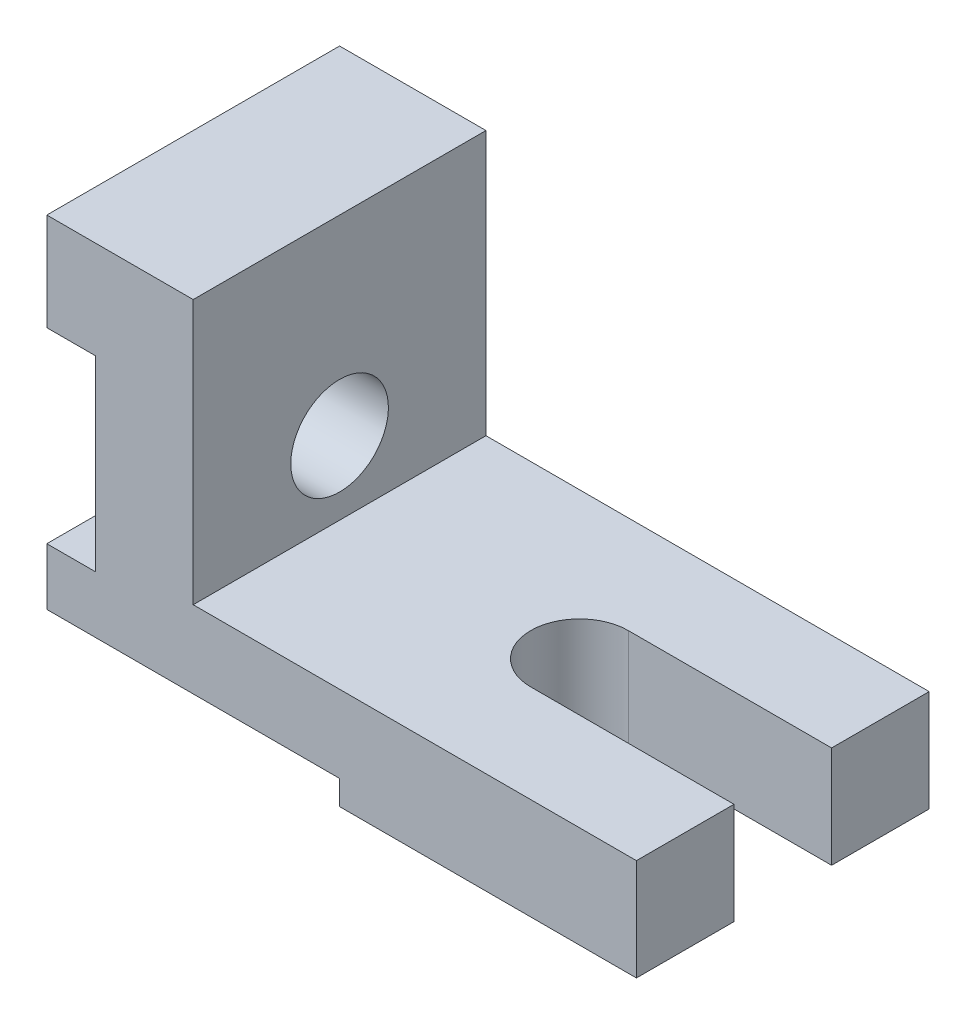
ISO-10303-21;
HEADER;
FILE_DESCRIPTION(('STEP AP214'),'2;1');
FILE_NAME('part.step','',(''),(''),'','','');
FILE_SCHEMA(('AUTOMOTIVE_DESIGN { 1 0 10303 214 1 1 1 1 }'));
ENDSEC;
DATA;
#1=APPLICATION_CONTEXT('core data for automotive mechanical design processes');
#2=APPLICATION_PROTOCOL_DEFINITION('international standard','automotive_design',2000,#1);
#3=PRODUCT_CONTEXT('',#1,'mechanical');
#4=PRODUCT('Part','Part','',(#3));
#5=PRODUCT_RELATED_PRODUCT_CATEGORY('part','',(#4));
#6=PRODUCT_DEFINITION_FORMATION('','',#4);
#7=PRODUCT_DEFINITION_CONTEXT('part definition',#1,'design');
#8=PRODUCT_DEFINITION('design','',#6,#7);
#9=PRODUCT_DEFINITION_SHAPE('','',#8);
#10=(LENGTH_UNIT() NAMED_UNIT(*) SI_UNIT(.MILLI.,.METRE.));
#11=(NAMED_UNIT(*) PLANE_ANGLE_UNIT() SI_UNIT($,.RADIAN.));
#12=(NAMED_UNIT(*) SI_UNIT($,.STERADIAN.) SOLID_ANGLE_UNIT());
#13=UNCERTAINTY_MEASURE_WITH_UNIT(LENGTH_MEASURE(1.E-05),#10,'distance_accuracy_value','');
#14=(GEOMETRIC_REPRESENTATION_CONTEXT(3) GLOBAL_UNCERTAINTY_ASSIGNED_CONTEXT((#13)) GLOBAL_UNIT_ASSIGNED_CONTEXT((#10,
#11,#12)) REPRESENTATION_CONTEXT('',''));
#15=CARTESIAN_POINT('',(0.,0.,0.));
#16=DIRECTION('',(0.,0.,1.));
#17=DIRECTION('',(1.,0.,0.));
#18=AXIS2_PLACEMENT_3D('',#15,#16,#17);
#19=CARTESIAN_POINT('',(145.,25.,72.));
#20=DIRECTION('',(1.,0.,0.));
#21=DIRECTION('',(0.,0.,-1.));
#22=AXIS2_PLACEMENT_3D('',#19,#20,#21);
#23=PLANE('',#22);
#24=DIRECTION('',(0.,1.,0.));
#25=VECTOR('',#24,1.);
#26=CARTESIAN_POINT('',(145.,-0.000999999999997531,48.));
#27=LINE('',#26,#25);
#28=CARTESIAN_POINT('',(145.,0.,48.));
#29=VERTEX_POINT('',#28);
#30=CARTESIAN_POINT('',(145.,25.,48.));
#31=VERTEX_POINT('',#30);
#32=EDGE_CURVE('E193',#29,#31,#27,.T.);
#33=ORIENTED_EDGE('',*,*,#32,.T.);
#34=DIRECTION('',(0.,0.,-1.));
#35=VECTOR('',#34,1.);
#36=CARTESIAN_POINT('',(145.,25.,72.));
#37=LINE('',#36,#35);
#38=CARTESIAN_POINT('',(145.,25.,72.));
#39=VERTEX_POINT('',#38);
#40=EDGE_CURVE('E208',#39,#31,#37,.T.);
#41=ORIENTED_EDGE('',*,*,#40,.F.);
#42=DIRECTION('',(0.,-1.,0.));
#43=VECTOR('',#42,1.);
#44=CARTESIAN_POINT('',(145.,25.,72.));
#45=LINE('',#44,#43);
#46=CARTESIAN_POINT('',(145.,0.,72.));
#47=VERTEX_POINT('',#46);
#48=EDGE_CURVE('E318',#39,#47,#45,.T.);
#49=ORIENTED_EDGE('',*,*,#48,.T.);
#50=DIRECTION('',(0.,0.,-1.));
#51=VECTOR('',#50,1.);
#52=CARTESIAN_POINT('',(145.,0.,72.));
#53=LINE('',#52,#51);
#54=EDGE_CURVE('E56',#47,#29,#53,.T.);
#55=ORIENTED_EDGE('',*,*,#54,.T.);
#56=EDGE_LOOP('',(#33,#41,#49,#55));
#57=FACE_BOUND('',#56,.T.);
#58=ADVANCED_FACE('F47',(#57),#23,.T.);
#59=CARTESIAN_POINT('',(12.,66.,72.));
#60=DIRECTION('',(1.,0.,0.));
#61=DIRECTION('',(0.,1.,0.));
#62=AXIS2_PLACEMENT_3D('',#59,#60,#61);
#63=PLANE('',#62);
#64=DIRECTION('',(0.,-1.,0.));
#65=VECTOR('',#64,1.);
#66=CARTESIAN_POINT('',(12.,66.,0.));
#67=LINE('',#66,#65);
#68=CARTESIAN_POINT('',(12.,66.,0.));
#69=VERTEX_POINT('',#68);
#70=CARTESIAN_POINT('',(12.,20.,0.));
#71=VERTEX_POINT('',#70);
#72=EDGE_CURVE('E259',#69,#71,#67,.T.);
#73=ORIENTED_EDGE('',*,*,#72,.T.);
#74=DIRECTION('',(0.,0.,-1.));
#75=VECTOR('',#74,1.);
#76=CARTESIAN_POINT('',(12.,20.,72.));
#77=LINE('',#76,#75);
#78=CARTESIAN_POINT('',(12.,20.,16.7386397157418));
#79=VERTEX_POINT('',#78);
#80=EDGE_CURVE('E248',#79,#71,#77,.T.);
#81=ORIENTED_EDGE('',*,*,#80,.F.);
#82=CARTESIAN_POINT('',(12.,43.,36.));
#83=DIRECTION('',(-1.,0.,0.));
#84=DIRECTION('',(0.,-1.,0.));
#85=AXIS2_PLACEMENT_3D('',#82,#83,#84);
#86=CIRCLE('',#85,30.);
#87=CARTESIAN_POINT('',(12.,20.,55.2613602842582));
#88=VERTEX_POINT('',#87);
#89=EDGE_CURVE('E378',#79,#88,#86,.T.);
#90=ORIENTED_EDGE('',*,*,#89,.T.);
#91=CARTESIAN_POINT('',(12.,20.,72.));
#92=VERTEX_POINT('',#91);
#93=EDGE_CURVE('E244',#92,#88,#77,.T.);
#94=ORIENTED_EDGE('',*,*,#93,.F.);
#95=DIRECTION('',(0.,-1.,0.));
#96=VECTOR('',#95,1.);
#97=CARTESIAN_POINT('',(12.,66.,72.));
#98=LINE('',#97,#96);
#99=CARTESIAN_POINT('',(12.,66.,72.));
#100=VERTEX_POINT('',#99);
#101=EDGE_CURVE('E299',#100,#92,#98,.T.);
#102=ORIENTED_EDGE('',*,*,#101,.F.);
#103=DIRECTION('',(0.,0.,-1.));
#104=VECTOR('',#103,1.);
#105=CARTESIAN_POINT('',(12.,66.,72.));
#106=LINE('',#105,#104);
#107=CARTESIAN_POINT('',(12.,66.,55.2613602842582));
#108=VERTEX_POINT('',#107);
#109=EDGE_CURVE('E240',#100,#108,#106,.T.);
#110=ORIENTED_EDGE('',*,*,#109,.T.);
#111=CARTESIAN_POINT('',(12.,43.,36.));
#112=DIRECTION('',(-1.,0.,0.));
#113=DIRECTION('',(0.,-1.,0.));
#114=AXIS2_PLACEMENT_3D('',#111,#112,#113);
#115=CIRCLE('',#114,30.);
#116=CARTESIAN_POINT('',(12.,66.,16.7386397157418));
#117=VERTEX_POINT('',#116);
#118=EDGE_CURVE('E71',#108,#117,#115,.T.);
#119=ORIENTED_EDGE('',*,*,#118,.T.);
#120=EDGE_CURVE('E243',#117,#69,#106,.T.);
#121=ORIENTED_EDGE('',*,*,#120,.T.);
#122=EDGE_LOOP('',(#73,#81,#90,#94,#102,#110,#119,#121));
#123=FACE_BOUND('',#122,.T.);
#124=CARTESIAN_POINT('',(12.,43.,36.));
#125=DIRECTION('',(-1.,0.,0.));
#126=DIRECTION('',(0.,0.,1.));
#127=AXIS2_PLACEMENT_3D('',#124,#125,#126);
#128=CIRCLE('',#127,12.);
#129=CARTESIAN_POINT('',(12.,43.,48.));
#130=VERTEX_POINT('',#129);
#131=EDGE_CURVE('E392',#130,#130,#128,.T.);
#132=ORIENTED_EDGE('',*,*,#131,.F.);
#133=EDGE_LOOP('',(#132));
#134=FACE_BOUND('',#133,.T.);
#135=ADVANCED_FACE('F455',(#123,#134),#63,.F.);
#136=CARTESIAN_POINT('',(0.,20.,72.));
#137=DIRECTION('',(1.,0.,0.));
#138=DIRECTION('',(0.,1.,0.));
#139=AXIS2_PLACEMENT_3D('',#136,#137,#138);
#140=PLANE('',#139);
#141=CARTESIAN_POINT('',(0.,43.,36.));
#142=DIRECTION('',(1.,0.,0.));
#143=DIRECTION('',(0.,1.,0.));
#144=AXIS2_PLACEMENT_3D('',#141,#142,#143);
#145=CIRCLE('',#144,30.);
#146=CARTESIAN_POINT('',(0.,20.,55.2613602842582));
#147=VERTEX_POINT('',#146);
#148=CARTESIAN_POINT('',(0.,20.,16.7386397157418));
#149=VERTEX_POINT('',#148);
#150=EDGE_CURVE('E345',#147,#149,#145,.T.);
#151=ORIENTED_EDGE('',*,*,#150,.T.);
#152=DIRECTION('',(0.,0.,-1.));
#153=VECTOR('',#152,1.);
#154=CARTESIAN_POINT('',(0.,20.,72.));
#155=LINE('',#154,#153);
#156=CARTESIAN_POINT('',(0.,20.,0.));
#157=VERTEX_POINT('',#156);
#158=EDGE_CURVE('E253',#149,#157,#155,.T.);
#159=ORIENTED_EDGE('',*,*,#158,.T.);
#160=DIRECTION('',(0.,-1.,0.));
#161=VECTOR('',#160,1.);
#162=CARTESIAN_POINT('',(0.,20.,0.));
#163=LINE('',#162,#161);
#164=CARTESIAN_POINT('',(0.,0.,0.));
#165=VERTEX_POINT('',#164);
#166=EDGE_CURVE('E291',#157,#165,#163,.T.);
#167=ORIENTED_EDGE('',*,*,#166,.T.);
#168=DIRECTION('',(0.,0.,-1.));
#169=VECTOR('',#168,1.);
#170=CARTESIAN_POINT('',(0.,0.,72.));
#171=LINE('',#170,#169);
#172=CARTESIAN_POINT('',(0.,0.,22.));
#173=VERTEX_POINT('',#172);
#174=EDGE_CURVE('E11',#173,#165,#171,.T.);
#175=ORIENTED_EDGE('',*,*,#174,.F.);
#176=DIRECTION('',(0.,-1.,0.));
#177=VECTOR('',#176,1.);
#178=CARTESIAN_POINT('',(0.,0.,22.));
#179=LINE('',#178,#177);
#180=CARTESIAN_POINT('',(0.,6.,22.));
#181=VERTEX_POINT('',#180);
#182=EDGE_CURVE('E340',#181,#173,#179,.T.);
#183=ORIENTED_EDGE('',*,*,#182,.F.);
#184=DIRECTION('',(0.,0.,1.));
#185=VECTOR('',#184,1.);
#186=CARTESIAN_POINT('',(0.,6.,22.));
#187=LINE('',#186,#185);
#188=CARTESIAN_POINT('',(0.,6.,72.));
#189=VERTEX_POINT('',#188);
#190=EDGE_CURVE('E295',#181,#189,#187,.T.);
#191=ORIENTED_EDGE('',*,*,#190,.T.);
#192=DIRECTION('',(0.,-1.,0.));
#193=VECTOR('',#192,1.);
#194=CARTESIAN_POINT('',(0.,20.,72.));
#195=LINE('',#194,#193);
#196=CARTESIAN_POINT('',(0.,20.,72.));
#197=VERTEX_POINT('',#196);
#198=EDGE_CURVE('E258',#197,#189,#195,.T.);
#199=ORIENTED_EDGE('',*,*,#198,.F.);
#200=EDGE_CURVE('E249',#197,#147,#155,.T.);
#201=ORIENTED_EDGE('',*,*,#200,.T.);
#202=EDGE_LOOP('',(#151,#159,#167,#175,#183,#191,#199,#201));
#203=FACE_BOUND('',#202,.T.);
#204=ADVANCED_FACE('F49',(#203),#140,.F.);
#205=CARTESIAN_POINT('',(0.,90.,72.));
#206=DIRECTION('',(1.,0.,0.));
#207=DIRECTION('',(0.,1.,0.));
#208=AXIS2_PLACEMENT_3D('',#205,#206,#207);
#209=PLANE('',#208);
#210=CARTESIAN_POINT('',(0.,43.,36.));
#211=DIRECTION('',(1.,0.,0.));
#212=DIRECTION('',(0.,1.,0.));
#213=AXIS2_PLACEMENT_3D('',#210,#211,#212);
#214=CIRCLE('',#213,30.);
#215=CARTESIAN_POINT('',(0.,66.,16.7386397157418));
#216=VERTEX_POINT('',#215);
#217=CARTESIAN_POINT('',(0.,66.,55.2613602842582));
#218=VERTEX_POINT('',#217);
#219=EDGE_CURVE('E359',#216,#218,#214,.T.);
#220=ORIENTED_EDGE('',*,*,#219,.T.);
#221=DIRECTION('',(0.,0.,-1.));
#222=VECTOR('',#221,1.);
#223=CARTESIAN_POINT('',(0.,66.,72.));
#224=LINE('',#223,#222);
#225=CARTESIAN_POINT('',(0.,66.,72.));
#226=VERTEX_POINT('',#225);
#227=EDGE_CURVE('E235',#226,#218,#224,.T.);
#228=ORIENTED_EDGE('',*,*,#227,.F.);
#229=DIRECTION('',(0.,-1.,0.));
#230=VECTOR('',#229,1.);
#231=CARTESIAN_POINT('',(0.,90.,72.));
#232=LINE('',#231,#230);
#233=CARTESIAN_POINT('',(0.,90.,72.));
#234=VERTEX_POINT('',#233);
#235=EDGE_CURVE('E305',#234,#226,#232,.T.);
#236=ORIENTED_EDGE('',*,*,#235,.F.);
#237=DIRECTION('',(0.,0.,-1.));
#238=VECTOR('',#237,1.);
#239=CARTESIAN_POINT('',(0.,90.,72.));
#240=LINE('',#239,#238);
#241=CARTESIAN_POINT('',(0.,90.,0.));
#242=VERTEX_POINT('',#241);
#243=EDGE_CURVE('E232',#234,#242,#240,.T.);
#244=ORIENTED_EDGE('',*,*,#243,.T.);
#245=DIRECTION('',(0.,-1.,0.));
#246=VECTOR('',#245,1.);
#247=CARTESIAN_POINT('',(0.,90.,0.));
#248=LINE('',#247,#246);
#249=CARTESIAN_POINT('',(0.,66.,0.));
#250=VERTEX_POINT('',#249);
#251=EDGE_CURVE('E267',#242,#250,#248,.T.);
#252=ORIENTED_EDGE('',*,*,#251,.T.);
#253=EDGE_CURVE('E239',#216,#250,#224,.T.);
#254=ORIENTED_EDGE('',*,*,#253,.F.);
#255=EDGE_LOOP('',(#220,#228,#236,#244,#252,#254));
#256=FACE_BOUND('',#255,.T.);
#257=ADVANCED_FACE('F474',(#256),#209,.F.);
#258=CARTESIAN_POINT('',(0.,66.,72.));
#259=DIRECTION('',(0.,1.,0.));
#260=DIRECTION('',(0.,0.,1.));
#261=AXIS2_PLACEMENT_3D('',#258,#259,#260);
#262=PLANE('',#261);
#263=DIRECTION('',(1.,0.,0.));
#264=VECTOR('',#263,1.);
#265=CARTESIAN_POINT('',(-0.00100000000001314,66.,55.2613602842582));
#266=LINE('',#265,#264);
#267=EDGE_CURVE('E364',#218,#108,#266,.T.);
#268=ORIENTED_EDGE('',*,*,#267,.T.);
#269=ORIENTED_EDGE('',*,*,#109,.F.);
#270=DIRECTION('',(1.,0.,0.));
#271=VECTOR('',#270,1.);
#272=CARTESIAN_POINT('',(0.,66.,72.));
#273=LINE('',#272,#271);
#274=EDGE_CURVE('E302',#226,#100,#273,.T.);
#275=ORIENTED_EDGE('',*,*,#274,.F.);
#276=ORIENTED_EDGE('',*,*,#227,.T.);
#277=EDGE_LOOP('',(#268,#269,#275,#276));
#278=FACE_BOUND('',#277,.T.);
#279=ADVANCED_FACE('F476',(#278),#262,.F.);
#280=DIRECTION('',(1.,0.,0.));
#281=VECTOR('',#280,1.);
#282=CARTESIAN_POINT('',(-0.00100000000001314,66.,16.7386397157418));
#283=LINE('',#282,#281);
#284=EDGE_CURVE('E368',#117,#216,#283,.F.);
#285=ORIENTED_EDGE('',*,*,#284,.T.);
#286=ORIENTED_EDGE('',*,*,#253,.T.);
#287=DIRECTION('',(1.,0.,0.));
#288=VECTOR('',#287,1.);
#289=CARTESIAN_POINT('',(0.,66.,0.));
#290=LINE('',#289,#288);
#291=EDGE_CURVE('E263',#250,#69,#290,.T.);
#292=ORIENTED_EDGE('',*,*,#291,.T.);
#293=ORIENTED_EDGE('',*,*,#120,.F.);
#294=EDGE_LOOP('',(#285,#286,#292,#293));
#295=FACE_BOUND('',#294,.T.);
#296=ADVANCED_FACE('F460',(#295),#262,.F.);
#297=CARTESIAN_POINT('',(12.,20.,72.));
#298=DIRECTION('',(0.,-1.,0.));
#299=DIRECTION('',(1.,0.,0.));
#300=AXIS2_PLACEMENT_3D('',#297,#298,#299);
#301=PLANE('',#300);
#302=DIRECTION('',(1.,0.,0.));
#303=VECTOR('',#302,1.);
#304=CARTESIAN_POINT('',(-0.00100000000001979,20.,16.7386397157418));
#305=LINE('',#304,#303);
#306=EDGE_CURVE('E382',#149,#79,#305,.T.);
#307=ORIENTED_EDGE('',*,*,#306,.T.);
#308=ORIENTED_EDGE('',*,*,#80,.T.);
#309=DIRECTION('',(-1.,0.,0.));
#310=VECTOR('',#309,1.);
#311=CARTESIAN_POINT('',(12.,20.,0.));
#312=LINE('',#311,#310);
#313=EDGE_CURVE('E254',#71,#157,#312,.T.);
#314=ORIENTED_EDGE('',*,*,#313,.T.);
#315=ORIENTED_EDGE('',*,*,#158,.F.);
#316=EDGE_LOOP('',(#307,#308,#314,#315));
#317=FACE_BOUND('',#316,.T.);
#318=ADVANCED_FACE('F452',(#317),#301,.F.);
#319=DIRECTION('',(1.,0.,0.));
#320=VECTOR('',#319,1.);
#321=CARTESIAN_POINT('',(-0.00100000000001979,20.,55.2613602842582));
#322=LINE('',#321,#320);
#323=EDGE_CURVE('E363',#88,#147,#322,.F.);
#324=ORIENTED_EDGE('',*,*,#323,.T.);
#325=ORIENTED_EDGE('',*,*,#200,.F.);
#326=DIRECTION('',(-1.,0.,0.));
#327=VECTOR('',#326,1.);
#328=CARTESIAN_POINT('',(12.,20.,72.));
#329=LINE('',#328,#327);
#330=EDGE_CURVE('E296',#92,#197,#329,.T.);
#331=ORIENTED_EDGE('',*,*,#330,.F.);
#332=ORIENTED_EDGE('',*,*,#93,.T.);
#333=EDGE_LOOP('',(#324,#325,#331,#332));
#334=FACE_BOUND('',#333,.T.);
#335=ADVANCED_FACE('F483',(#334),#301,.F.);
#336=CARTESIAN_POINT('',(29.6466369276166,0.,72.));
#337=DIRECTION('',(0.,1.,0.));
#338=DIRECTION('',(0.,0.,1.));
#339=AXIS2_PLACEMENT_3D('',#336,#337,#338);
#340=PLANE('',#339);
#341=CARTESIAN_POINT('',(95.,0.,36.));
#342=DIRECTION('',(0.,1.,0.));
#343=DIRECTION('',(0.,0.,1.));
#344=AXIS2_PLACEMENT_3D('',#341,#342,#343);
#345=CIRCLE('',#344,12.);
#346=CARTESIAN_POINT('',(95.,0.,48.));
#347=VERTEX_POINT('',#346);
#348=CARTESIAN_POINT('',(95.,0.,24.));
#349=VERTEX_POINT('',#348);
#350=EDGE_CURVE('E212',#347,#349,#345,.F.);
#351=ORIENTED_EDGE('',*,*,#350,.F.);
#352=DIRECTION('',(-1.,0.,0.));
#353=VECTOR('',#352,1.);
#354=CARTESIAN_POINT('',(195.,0.,48.));
#355=LINE('',#354,#353);
#356=EDGE_CURVE('E408',#29,#347,#355,.T.);
#357=ORIENTED_EDGE('',*,*,#356,.F.);
#358=ORIENTED_EDGE('',*,*,#54,.F.);
#359=DIRECTION('',(1.,0.,0.));
#360=VECTOR('',#359,1.);
#361=CARTESIAN_POINT('',(0.,0.,72.));
#362=LINE('',#361,#360);
#363=CARTESIAN_POINT('',(72.,0.,72.));
#364=VERTEX_POINT('',#363);
#365=EDGE_CURVE('E321',#364,#47,#362,.T.);
#366=ORIENTED_EDGE('',*,*,#365,.F.);
#367=DIRECTION('',(0.,0.,1.));
#368=VECTOR('',#367,1.);
#369=CARTESIAN_POINT('',(72.,0.,22.));
#370=LINE('',#369,#368);
#371=CARTESIAN_POINT('',(72.,0.,22.));
#372=VERTEX_POINT('',#371);
#373=EDGE_CURVE('E327',#372,#364,#370,.T.);
#374=ORIENTED_EDGE('',*,*,#373,.F.);
#375=DIRECTION('',(1.,0.,0.));
#376=VECTOR('',#375,1.);
#377=CARTESIAN_POINT('',(0.,0.,22.));
#378=LINE('',#377,#376);
#379=EDGE_CURVE('E353',#173,#372,#378,.T.);
#380=ORIENTED_EDGE('',*,*,#379,.F.);
#381=ORIENTED_EDGE('',*,*,#174,.T.);
#382=DIRECTION('',(1.,0.,0.));
#383=VECTOR('',#382,1.);
#384=CARTESIAN_POINT('',(29.6466369276166,0.,0.));
#385=LINE('',#384,#383);
#386=CARTESIAN_POINT('',(145.,0.,0.));
#387=VERTEX_POINT('',#386);
#388=EDGE_CURVE('E287',#165,#387,#385,.T.);
#389=ORIENTED_EDGE('',*,*,#388,.T.);
#390=CARTESIAN_POINT('',(145.,0.,24.));
#391=VERTEX_POINT('',#390);
#392=EDGE_CURVE('E219',#391,#387,#53,.T.);
#393=ORIENTED_EDGE('',*,*,#392,.F.);
#394=DIRECTION('',(1.,0.,0.));
#395=VECTOR('',#394,1.);
#396=CARTESIAN_POINT('',(195.,0.,24.));
#397=LINE('',#396,#395);
#398=EDGE_CURVE('E396',#349,#391,#397,.T.);
#399=ORIENTED_EDGE('',*,*,#398,.F.);
#400=EDGE_LOOP('',(#351,#357,#358,#366,#374,#380,#381,#389,#393,#399));
#401=FACE_BOUND('',#400,.T.);
#402=ADVANCED_FACE('F422',(#401),#340,.F.);
#403=DIRECTION('',(0.,-1.,0.));
#404=VECTOR('',#403,1.);
#405=CARTESIAN_POINT('',(145.,-0.000999999999997531,24.));
#406=LINE('',#405,#404);
#407=CARTESIAN_POINT('',(145.,25.,24.));
#408=VERTEX_POINT('',#407);
#409=EDGE_CURVE('E63',#408,#391,#406,.T.);
#410=ORIENTED_EDGE('',*,*,#409,.T.);
#411=ORIENTED_EDGE('',*,*,#392,.T.);
#412=DIRECTION('',(0.,-1.,0.));
#413=VECTOR('',#412,1.);
#414=CARTESIAN_POINT('',(145.,25.,0.));
#415=LINE('',#414,#413);
#416=CARTESIAN_POINT('',(145.,25.,0.));
#417=VERTEX_POINT('',#416);
#418=EDGE_CURVE('E283',#417,#387,#415,.T.);
#419=ORIENTED_EDGE('',*,*,#418,.F.);
#420=EDGE_CURVE('E220',#408,#417,#37,.T.);
#421=ORIENTED_EDGE('',*,*,#420,.F.);
#422=EDGE_LOOP('',(#410,#411,#419,#421));
#423=FACE_BOUND('',#422,.T.);
#424=ADVANCED_FACE('F417',(#423),#23,.T.);
#425=CARTESIAN_POINT('',(36.,25.,72.));
#426=DIRECTION('',(0.,1.,0.));
#427=DIRECTION('',(-1.,0.,0.));
#428=AXIS2_PLACEMENT_3D('',#425,#426,#427);
#429=PLANE('',#428);
#430=DIRECTION('',(1.,0.,0.));
#431=VECTOR('',#430,1.);
#432=CARTESIAN_POINT('',(195.,25.,48.));
#433=LINE('',#432,#431);
#434=CARTESIAN_POINT('',(95.,25.,48.));
#435=VERTEX_POINT('',#434);
#436=EDGE_CURVE('E190',#435,#31,#433,.T.);
#437=ORIENTED_EDGE('',*,*,#436,.F.);
#438=CARTESIAN_POINT('',(95.,25.,36.));
#439=DIRECTION('',(0.,1.,0.));
#440=DIRECTION('',(-1.,0.,0.));
#441=AXIS2_PLACEMENT_3D('',#438,#439,#440);
#442=CIRCLE('',#441,12.);
#443=CARTESIAN_POINT('',(95.,25.,24.));
#444=VERTEX_POINT('',#443);
#445=EDGE_CURVE('E203',#444,#435,#442,.T.);
#446=ORIENTED_EDGE('',*,*,#445,.F.);
#447=DIRECTION('',(-1.,0.,0.));
#448=VECTOR('',#447,1.);
#449=CARTESIAN_POINT('',(195.,25.,24.));
#450=LINE('',#449,#448);
#451=EDGE_CURVE('E405',#408,#444,#450,.T.);
#452=ORIENTED_EDGE('',*,*,#451,.F.);
#453=ORIENTED_EDGE('',*,*,#420,.T.);
#454=DIRECTION('',(1.,0.,0.));
#455=VECTOR('',#454,1.);
#456=CARTESIAN_POINT('',(36.,25.,0.));
#457=LINE('',#456,#455);
#458=CARTESIAN_POINT('',(36.,25.,0.));
#459=VERTEX_POINT('',#458);
#460=EDGE_CURVE('E279',#459,#417,#457,.T.);
#461=ORIENTED_EDGE('',*,*,#460,.F.);
#462=DIRECTION('',(0.,0.,-1.));
#463=VECTOR('',#462,1.);
#464=CARTESIAN_POINT('',(36.,25.,72.));
#465=LINE('',#464,#463);
#466=CARTESIAN_POINT('',(36.,25.,72.));
#467=VERTEX_POINT('',#466);
#468=EDGE_CURVE('E224',#467,#459,#465,.T.);
#469=ORIENTED_EDGE('',*,*,#468,.F.);
#470=DIRECTION('',(1.,0.,0.));
#471=VECTOR('',#470,1.);
#472=CARTESIAN_POINT('',(36.,25.,72.));
#473=LINE('',#472,#471);
#474=EDGE_CURVE('E217',#467,#39,#473,.T.);
#475=ORIENTED_EDGE('',*,*,#474,.T.);
#476=ORIENTED_EDGE('',*,*,#40,.T.);
#477=EDGE_LOOP('',(#437,#446,#452,#453,#461,#469,#475,#476));
#478=FACE_BOUND('',#477,.T.);
#479=ADVANCED_FACE('F215',(#478),#429,.T.);
#480=CARTESIAN_POINT('',(36.,90.,72.));
#481=DIRECTION('',(1.,0.,0.));
#482=DIRECTION('',(0.,1.,0.));
#483=AXIS2_PLACEMENT_3D('',#480,#481,#482);
#484=PLANE('',#483);
#485=CARTESIAN_POINT('',(36.,43.,36.));
#486=DIRECTION('',(1.,0.,0.));
#487=DIRECTION('',(0.,1.,0.));
#488=AXIS2_PLACEMENT_3D('',#485,#486,#487);
#489=CIRCLE('',#488,12.);
#490=CARTESIAN_POINT('',(36.,55.,36.));
#491=VERTEX_POINT('',#490);
#492=EDGE_CURVE('E372',#491,#491,#489,.T.);
#493=ORIENTED_EDGE('',*,*,#492,.F.);
#494=EDGE_LOOP('',(#493));
#495=FACE_BOUND('',#494,.T.);
#496=DIRECTION('',(0.,-1.,0.));
#497=VECTOR('',#496,1.);
#498=CARTESIAN_POINT('',(36.,90.,0.));
#499=LINE('',#498,#497);
#500=CARTESIAN_POINT('',(36.,90.,0.));
#501=VERTEX_POINT('',#500);
#502=EDGE_CURVE('E275',#501,#459,#499,.T.);
#503=ORIENTED_EDGE('',*,*,#502,.F.);
#504=DIRECTION('',(0.,0.,-1.));
#505=VECTOR('',#504,1.);
#506=CARTESIAN_POINT('',(36.,90.,72.));
#507=LINE('',#506,#505);
#508=CARTESIAN_POINT('',(36.,90.,72.));
#509=VERTEX_POINT('',#508);
#510=EDGE_CURVE('E229',#509,#501,#507,.T.);
#511=ORIENTED_EDGE('',*,*,#510,.F.);
#512=DIRECTION('',(0.,-1.,0.));
#513=VECTOR('',#512,1.);
#514=CARTESIAN_POINT('',(36.,90.,72.));
#515=LINE('',#514,#513);
#516=EDGE_CURVE('E312',#509,#467,#515,.T.);
#517=ORIENTED_EDGE('',*,*,#516,.T.);
#518=ORIENTED_EDGE('',*,*,#468,.T.);
#519=EDGE_LOOP('',(#503,#511,#517,#518));
#520=FACE_BOUND('',#519,.T.);
#521=ADVANCED_FACE('F470',(#495,#520),#484,.T.);
#522=CARTESIAN_POINT('',(0.,90.,72.));
#523=DIRECTION('',(0.,1.,0.));
#524=DIRECTION('',(0.,0.,1.));
#525=AXIS2_PLACEMENT_3D('',#522,#523,#524);
#526=PLANE('',#525);
#527=DIRECTION('',(1.,0.,0.));
#528=VECTOR('',#527,1.);
#529=CARTESIAN_POINT('',(0.,90.,0.));
#530=LINE('',#529,#528);
#531=EDGE_CURVE('E271',#242,#501,#530,.T.);
#532=ORIENTED_EDGE('',*,*,#531,.F.);
#533=ORIENTED_EDGE('',*,*,#243,.F.);
#534=DIRECTION('',(1.,0.,0.));
#535=VECTOR('',#534,1.);
#536=CARTESIAN_POINT('',(0.,90.,72.));
#537=LINE('',#536,#535);
#538=EDGE_CURVE('E308',#234,#509,#537,.T.);
#539=ORIENTED_EDGE('',*,*,#538,.T.);
#540=ORIENTED_EDGE('',*,*,#510,.T.);
#541=EDGE_LOOP('',(#532,#533,#539,#540));
#542=FACE_BOUND('',#541,.T.);
#543=ADVANCED_FACE('F466',(#542),#526,.T.);
#544=CARTESIAN_POINT('',(0.,0.,72.));
#545=DIRECTION('',(0.,0.,1.));
#546=DIRECTION('',(1.,0.,0.));
#547=AXIS2_PLACEMENT_3D('',#544,#545,#546);
#548=PLANE('',#547);
#549=DIRECTION('',(-1.,0.,0.));
#550=VECTOR('',#549,1.);
#551=CARTESIAN_POINT('',(0.,6.,72.));
#552=LINE('',#551,#550);
#553=CARTESIAN_POINT('',(72.,6.,72.));
#554=VERTEX_POINT('',#553);
#555=EDGE_CURVE('E337',#554,#189,#552,.T.);
#556=ORIENTED_EDGE('',*,*,#555,.F.);
#557=DIRECTION('',(0.,1.,0.));
#558=VECTOR('',#557,1.);
#559=CARTESIAN_POINT('',(72.,0.,72.));
#560=LINE('',#559,#558);
#561=EDGE_CURVE('E341',#364,#554,#560,.T.);
#562=ORIENTED_EDGE('',*,*,#561,.F.);
#563=ORIENTED_EDGE('',*,*,#365,.T.);
#564=ORIENTED_EDGE('',*,*,#48,.F.);
#565=ORIENTED_EDGE('',*,*,#474,.F.);
#566=ORIENTED_EDGE('',*,*,#516,.F.);
#567=ORIENTED_EDGE('',*,*,#538,.F.);
#568=ORIENTED_EDGE('',*,*,#235,.T.);
#569=ORIENTED_EDGE('',*,*,#274,.T.);
#570=ORIENTED_EDGE('',*,*,#101,.T.);
#571=ORIENTED_EDGE('',*,*,#330,.T.);
#572=ORIENTED_EDGE('',*,*,#198,.T.);
#573=EDGE_LOOP('',(#556,#562,#563,#564,#565,#566,#567,#568,#569,#570,#571,#572));
#574=FACE_BOUND('',#573,.T.);
#575=ADVANCED_FACE('F439',(#574),#548,.T.);
#576=CARTESIAN_POINT('',(0.,0.,0.));
#577=DIRECTION('',(0.,0.,1.));
#578=DIRECTION('',(1.,0.,0.));
#579=AXIS2_PLACEMENT_3D('',#576,#577,#578);
#580=PLANE('',#579);
#581=ORIENTED_EDGE('',*,*,#166,.F.);
#582=ORIENTED_EDGE('',*,*,#313,.F.);
#583=ORIENTED_EDGE('',*,*,#72,.F.);
#584=ORIENTED_EDGE('',*,*,#291,.F.);
#585=ORIENTED_EDGE('',*,*,#251,.F.);
#586=ORIENTED_EDGE('',*,*,#531,.T.);
#587=ORIENTED_EDGE('',*,*,#502,.T.);
#588=ORIENTED_EDGE('',*,*,#460,.T.);
#589=ORIENTED_EDGE('',*,*,#418,.T.);
#590=ORIENTED_EDGE('',*,*,#388,.F.);
#591=EDGE_LOOP('',(#581,#582,#583,#584,#585,#586,#587,#588,#589,#590));
#592=FACE_BOUND('',#591,.T.);
#593=ADVANCED_FACE('F428',(#592),#580,.F.);
#594=CARTESIAN_POINT('',(0.,6.,22.));
#595=DIRECTION('',(0.,1.,0.));
#596=DIRECTION('',(0.,0.,1.));
#597=AXIS2_PLACEMENT_3D('',#594,#595,#596);
#598=PLANE('',#597);
#599=ORIENTED_EDGE('',*,*,#555,.T.);
#600=ORIENTED_EDGE('',*,*,#190,.F.);
#601=DIRECTION('',(-1.,0.,0.));
#602=VECTOR('',#601,1.);
#603=CARTESIAN_POINT('',(0.,6.,22.));
#604=LINE('',#603,#602);
#605=CARTESIAN_POINT('',(72.,6.,22.));
#606=VERTEX_POINT('',#605);
#607=EDGE_CURVE('E331',#606,#181,#604,.T.);
#608=ORIENTED_EDGE('',*,*,#607,.F.);
#609=DIRECTION('',(0.,0.,1.));
#610=VECTOR('',#609,1.);
#611=CARTESIAN_POINT('',(72.,6.,22.));
#612=LINE('',#611,#610);
#613=EDGE_CURVE('E330',#606,#554,#612,.T.);
#614=ORIENTED_EDGE('',*,*,#613,.T.);
#615=EDGE_LOOP('',(#599,#600,#608,#614));
#616=FACE_BOUND('',#615,.T.);
#617=ADVANCED_FACE('F486',(#616),#598,.F.);
#618=CARTESIAN_POINT('',(72.,0.,22.));
#619=DIRECTION('',(1.,0.,0.));
#620=DIRECTION('',(0.,0.,-1.));
#621=AXIS2_PLACEMENT_3D('',#618,#619,#620);
#622=PLANE('',#621);
#623=ORIENTED_EDGE('',*,*,#561,.T.);
#624=ORIENTED_EDGE('',*,*,#613,.F.);
#625=DIRECTION('',(0.,1.,0.));
#626=VECTOR('',#625,1.);
#627=CARTESIAN_POINT('',(72.,0.,22.));
#628=LINE('',#627,#626);
#629=EDGE_CURVE('E349',#372,#606,#628,.T.);
#630=ORIENTED_EDGE('',*,*,#629,.F.);
#631=ORIENTED_EDGE('',*,*,#373,.T.);
#632=EDGE_LOOP('',(#623,#624,#630,#631));
#633=FACE_BOUND('',#632,.T.);
#634=ADVANCED_FACE('F443',(#633),#622,.F.);
#635=CARTESIAN_POINT('',(0.,0.,22.));
#636=DIRECTION('',(0.,0.,-1.));
#637=DIRECTION('',(-1.,0.,0.));
#638=AXIS2_PLACEMENT_3D('',#635,#636,#637);
#639=PLANE('',#638);
#640=ORIENTED_EDGE('',*,*,#182,.T.);
#641=ORIENTED_EDGE('',*,*,#379,.T.);
#642=ORIENTED_EDGE('',*,*,#629,.T.);
#643=ORIENTED_EDGE('',*,*,#607,.T.);
#644=EDGE_LOOP('',(#640,#641,#642,#643));
#645=FACE_BOUND('',#644,.T.);
#646=ADVANCED_FACE('F487',(#645),#639,.F.);
#647=CARTESIAN_POINT('',(-0.00100000000001314,43.,36.));
#648=DIRECTION('',(1.,0.,0.));
#649=DIRECTION('',(0.,1.,0.));
#650=AXIS2_PLACEMENT_3D('',#647,#648,#649);
#651=CYLINDRICAL_SURFACE('',#650,30.);
#652=ORIENTED_EDGE('',*,*,#150,.F.);
#653=ORIENTED_EDGE('',*,*,#323,.F.);
#654=ORIENTED_EDGE('',*,*,#89,.F.);
#655=ORIENTED_EDGE('',*,*,#306,.F.);
#656=EDGE_LOOP('',(#652,#653,#654,#655));
#657=FACE_BOUND('',#656,.T.);
#658=ADVANCED_FACE('F489',(#657),#651,.F.);
#659=CARTESIAN_POINT('',(-0.00100000000001314,43.,36.));
#660=DIRECTION('',(1.,0.,0.));
#661=DIRECTION('',(0.,1.,0.));
#662=AXIS2_PLACEMENT_3D('',#659,#660,#661);
#663=CYLINDRICAL_SURFACE('',#662,30.);
#664=ORIENTED_EDGE('',*,*,#219,.F.);
#665=ORIENTED_EDGE('',*,*,#284,.F.);
#666=ORIENTED_EDGE('',*,*,#118,.F.);
#667=ORIENTED_EDGE('',*,*,#267,.F.);
#668=EDGE_LOOP('',(#664,#665,#666,#667));
#669=FACE_BOUND('',#668,.T.);
#670=ADVANCED_FACE('F496',(#669),#663,.F.);
#671=CARTESIAN_POINT('',(12.,43.,36.));
#672=DIRECTION('',(-1.,0.,0.));
#673=DIRECTION('',(0.,0.,1.));
#674=AXIS2_PLACEMENT_3D('',#671,#672,#673);
#675=CYLINDRICAL_SURFACE('',#674,12.);
#676=ORIENTED_EDGE('',*,*,#131,.T.);
#677=EDGE_LOOP('',(#676));
#678=FACE_BOUND('',#677,.T.);
#679=ORIENTED_EDGE('',*,*,#492,.T.);
#680=EDGE_LOOP('',(#679));
#681=FACE_BOUND('',#680,.T.);
#682=ADVANCED_FACE('F537',(#678,#681),#675,.F.);
#683=CARTESIAN_POINT('',(195.,-0.000999999999997531,48.));
#684=DIRECTION('',(0.,0.,1.));
#685=DIRECTION('',(1.,0.,0.));
#686=AXIS2_PLACEMENT_3D('',#683,#684,#685);
#687=PLANE('',#686);
#688=ORIENTED_EDGE('',*,*,#356,.T.);
#689=DIRECTION('',(0.,1.,0.));
#690=VECTOR('',#689,1.);
#691=CARTESIAN_POINT('',(95.,-0.00100000000000447,48.));
#692=LINE('',#691,#690);
#693=EDGE_CURVE('E196',#347,#435,#692,.T.);
#694=ORIENTED_EDGE('',*,*,#693,.T.);
#695=ORIENTED_EDGE('',*,*,#436,.T.);
#696=ORIENTED_EDGE('',*,*,#32,.F.);
#697=EDGE_LOOP('',(#688,#694,#695,#696));
#698=FACE_BOUND('',#697,.T.);
#699=ADVANCED_FACE('F192',(#698),#687,.F.);
#700=CARTESIAN_POINT('',(95.,-0.00100000000000447,36.));
#701=DIRECTION('',(0.,1.,0.));
#702=DIRECTION('',(-1.,0.,0.));
#703=AXIS2_PLACEMENT_3D('',#700,#701,#702);
#704=CYLINDRICAL_SURFACE('',#703,12.);
#705=ORIENTED_EDGE('',*,*,#350,.T.);
#706=DIRECTION('',(0.,1.,0.));
#707=VECTOR('',#706,1.);
#708=CARTESIAN_POINT('',(95.,-0.00100000000000447,24.));
#709=LINE('',#708,#707);
#710=EDGE_CURVE('E202',#349,#444,#709,.T.);
#711=ORIENTED_EDGE('',*,*,#710,.T.);
#712=ORIENTED_EDGE('',*,*,#445,.T.);
#713=ORIENTED_EDGE('',*,*,#693,.F.);
#714=EDGE_LOOP('',(#705,#711,#712,#713));
#715=FACE_BOUND('',#714,.T.);
#716=ADVANCED_FACE('F434',(#715),#704,.F.);
#717=CARTESIAN_POINT('',(195.,-0.000999999999997531,24.));
#718=DIRECTION('',(0.,0.,-1.));
#719=DIRECTION('',(-1.,0.,0.));
#720=AXIS2_PLACEMENT_3D('',#717,#718,#719);
#721=PLANE('',#720);
#722=ORIENTED_EDGE('',*,*,#398,.T.);
#723=ORIENTED_EDGE('',*,*,#409,.F.);
#724=ORIENTED_EDGE('',*,*,#451,.T.);
#725=ORIENTED_EDGE('',*,*,#710,.F.);
#726=EDGE_LOOP('',(#722,#723,#724,#725));
#727=FACE_BOUND('',#726,.T.);
#728=ADVANCED_FACE('F432',(#727),#721,.F.);
#729=CLOSED_SHELL('',(#58,#135,#204,#257,#279,#296,#318,#335,#402,#424,#479,#521,#543,#575,#593,
#617,#634,#646,#658,#670,#682,#699,#716,#728));
#730=MANIFOLD_SOLID_BREP('B2',#729);
#731=ADVANCED_BREP_SHAPE_REPRESENTATION('',(#18,#730),#14);
#732=SHAPE_DEFINITION_REPRESENTATION(#9,#731);
ENDSEC;
END-ISO-10303-21;
